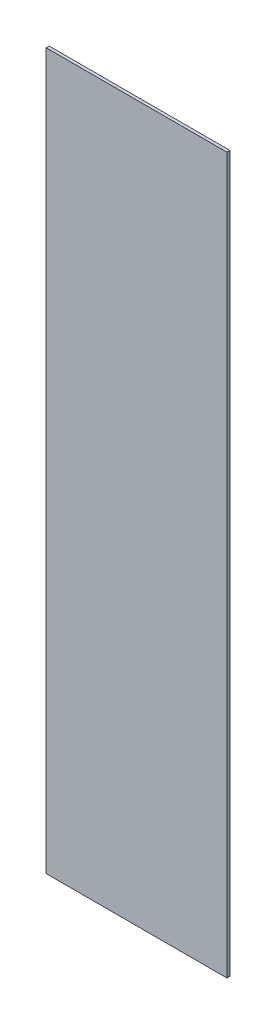
ISO-10303-21;
HEADER;
FILE_DESCRIPTION(('STEP AP214'),'2;1');
FILE_NAME('part.step','',(''),(''),'','','');
FILE_SCHEMA(('AUTOMOTIVE_DESIGN { 1 0 10303 214 1 1 1 1 }'));
ENDSEC;
DATA;
#1=APPLICATION_CONTEXT('core data for automotive mechanical design processes');
#2=APPLICATION_PROTOCOL_DEFINITION('international standard','automotive_design',2000,#1);
#3=PRODUCT_CONTEXT('',#1,'mechanical');
#4=PRODUCT('Part','Part','',(#3));
#5=PRODUCT_RELATED_PRODUCT_CATEGORY('part','',(#4));
#6=PRODUCT_DEFINITION_FORMATION('','',#4);
#7=PRODUCT_DEFINITION_CONTEXT('part definition',#1,'design');
#8=PRODUCT_DEFINITION('design','',#6,#7);
#9=PRODUCT_DEFINITION_SHAPE('','',#8);
#10=(LENGTH_UNIT() NAMED_UNIT(*) SI_UNIT(.MILLI.,.METRE.));
#11=(NAMED_UNIT(*) PLANE_ANGLE_UNIT() SI_UNIT($,.RADIAN.));
#12=(NAMED_UNIT(*) SI_UNIT($,.STERADIAN.) SOLID_ANGLE_UNIT());
#13=UNCERTAINTY_MEASURE_WITH_UNIT(LENGTH_MEASURE(1.E-05),#10,'distance_accuracy_value','');
#14=(GEOMETRIC_REPRESENTATION_CONTEXT(3) GLOBAL_UNCERTAINTY_ASSIGNED_CONTEXT((#13)) GLOBAL_UNIT_ASSIGNED_CONTEXT((#10,
#11,#12)) REPRESENTATION_CONTEXT('',''));
#15=CARTESIAN_POINT('',(0.,0.,0.));
#16=DIRECTION('',(0.,0.,1.));
#17=DIRECTION('',(1.,0.,0.));
#18=AXIS2_PLACEMENT_3D('',#15,#16,#17);
#19=CARTESIAN_POINT('',(0.04876188878365,0.295948113739439,0.00265058776767101));
#20=DIRECTION('',(-1.,0.,0.));
#21=DIRECTION('',(0.,0.,1.));
#22=AXIS2_PLACEMENT_3D('',#19,#20,#21);
#23=PLANE('',#22);
#24=DIRECTION('',(0.,0.,1.));
#25=VECTOR('',#24,1.);
#26=CARTESIAN_POINT('',(0.04876188878365,0.133896113739239,-4.94122323289E-05));
#27=LINE('',#26,#25);
#28=CARTESIAN_POINT('',(0.04876188878365,0.133896113739239,-4.94122323289E-05));
#29=VERTEX_POINT('',#28);
#30=CARTESIAN_POINT('',(0.04876188878365,0.133896113739239,0.00265058776767101));
#31=VERTEX_POINT('',#30);
#32=EDGE_CURVE('E11',#29,#31,#27,.T.);
#33=ORIENTED_EDGE('',*,*,#32,.T.);
#34=DIRECTION('',(0.,1.,0.));
#35=VECTOR('',#34,1.);
#36=CARTESIAN_POINT('',(0.04876188878365,0.133896113739239,0.00265058776767101));
#37=LINE('',#36,#35);
#38=CARTESIAN_POINT('',(0.04876188878365,0.458000113739639,0.00265058776767101));
#39=VERTEX_POINT('',#38);
#40=EDGE_CURVE('E24',#31,#39,#37,.T.);
#41=ORIENTED_EDGE('',*,*,#40,.T.);
#42=DIRECTION('',(0.,0.,1.));
#43=VECTOR('',#42,1.);
#44=CARTESIAN_POINT('',(0.04876188878365,0.458000113739639,-4.94122323289E-05));
#45=LINE('',#44,#43);
#46=CARTESIAN_POINT('',(0.04876188878365,0.458000113739639,-4.94122323289E-05));
#47=VERTEX_POINT('',#46);
#48=EDGE_CURVE('E99',#47,#39,#45,.T.);
#49=ORIENTED_EDGE('',*,*,#48,.F.);
#50=DIRECTION('',(0.,1.,0.));
#51=VECTOR('',#50,1.);
#52=CARTESIAN_POINT('',(0.04876188878365,0.133896113739239,-4.94122323289E-05));
#53=LINE('',#52,#51);
#54=EDGE_CURVE('E97',#29,#47,#53,.T.);
#55=ORIENTED_EDGE('',*,*,#54,.F.);
#56=EDGE_LOOP('',(#33,#41,#49,#55));
#57=FACE_BOUND('',#56,.T.);
#58=ADVANCED_FACE('F17',(#57),#23,.T.);
#59=CARTESIAN_POINT('',(0.13071918486355,0.458000113739639,0.00265058776767101));
#60=DIRECTION('',(0.,1.,0.));
#61=DIRECTION('',(0.,0.,1.));
#62=AXIS2_PLACEMENT_3D('',#59,#60,#61);
#63=PLANE('',#62);
#64=ORIENTED_EDGE('',*,*,#48,.T.);
#65=DIRECTION('',(1.,0.,0.));
#66=VECTOR('',#65,1.);
#67=CARTESIAN_POINT('',(0.04876188878365,0.458000113739639,0.00265058776767101));
#68=LINE('',#67,#66);
#69=CARTESIAN_POINT('',(0.21267648094345,0.458000113739639,0.00265058776767101));
#70=VERTEX_POINT('',#69);
#71=EDGE_CURVE('E95',#39,#70,#68,.T.);
#72=ORIENTED_EDGE('',*,*,#71,.T.);
#73=DIRECTION('',(0.,0.,1.));
#74=VECTOR('',#73,1.);
#75=CARTESIAN_POINT('',(0.21267648094345,0.458000113739639,-4.94122323289E-05));
#76=LINE('',#75,#74);
#77=CARTESIAN_POINT('',(0.21267648094345,0.458000113739639,-4.94122323289E-05));
#78=VERTEX_POINT('',#77);
#79=EDGE_CURVE('E92',#78,#70,#76,.T.);
#80=ORIENTED_EDGE('',*,*,#79,.F.);
#81=DIRECTION('',(1.,0.,0.));
#82=VECTOR('',#81,1.);
#83=CARTESIAN_POINT('',(0.04876188878365,0.458000113739639,-4.94122323289E-05));
#84=LINE('',#83,#82);
#85=EDGE_CURVE('E90',#47,#78,#84,.T.);
#86=ORIENTED_EDGE('',*,*,#85,.F.);
#87=EDGE_LOOP('',(#64,#72,#80,#86));
#88=FACE_BOUND('',#87,.T.);
#89=ADVANCED_FACE('F105',(#88),#63,.T.);
#90=CARTESIAN_POINT('',(0.21267648094345,0.133896113739689,0.00265058776767101));
#91=DIRECTION('',(1.,0.,0.));
#92=DIRECTION('',(0.,0.,-1.));
#93=AXIS2_PLACEMENT_3D('',#90,#91,#92);
#94=PLANE('',#93);
#95=ORIENTED_EDGE('',*,*,#79,.T.);
#96=DIRECTION('',(0.,-1.,0.));
#97=VECTOR('',#96,1.);
#98=CARTESIAN_POINT('',(0.21267648094345,0.458000113739639,0.00265058776767101));
#99=LINE('',#98,#97);
#100=CARTESIAN_POINT('',(0.21267648094345,-0.190207886260261,0.00265058776767101));
#101=VERTEX_POINT('',#100);
#102=EDGE_CURVE('E88',#70,#101,#99,.T.);
#103=ORIENTED_EDGE('',*,*,#102,.T.);
#104=DIRECTION('',(0.,0.,1.));
#105=VECTOR('',#104,1.);
#106=CARTESIAN_POINT('',(0.21267648094345,-0.190207886260261,-4.94122323289E-05));
#107=LINE('',#106,#105);
#108=CARTESIAN_POINT('',(0.21267648094345,-0.190207886260261,-4.94122323289E-05));
#109=VERTEX_POINT('',#108);
#110=EDGE_CURVE('E86',#109,#101,#107,.T.);
#111=ORIENTED_EDGE('',*,*,#110,.F.);
#112=DIRECTION('',(0.,-1.,0.));
#113=VECTOR('',#112,1.);
#114=CARTESIAN_POINT('',(0.21267648094345,0.458000113739639,-4.94122323289E-05));
#115=LINE('',#114,#113);
#116=EDGE_CURVE('E77',#78,#109,#115,.T.);
#117=ORIENTED_EDGE('',*,*,#116,.F.);
#118=EDGE_LOOP('',(#95,#103,#111,#117));
#119=FACE_BOUND('',#118,.T.);
#120=ADVANCED_FACE('F109',(#119),#94,.T.);
#121=CARTESIAN_POINT('',(0.13071918486355,-0.190207886260261,0.00265058776767101));
#122=DIRECTION('',(0.,-1.,0.));
#123=DIRECTION('',(0.,0.,-1.));
#124=AXIS2_PLACEMENT_3D('',#121,#122,#123);
#125=PLANE('',#124);
#126=ORIENTED_EDGE('',*,*,#110,.T.);
#127=DIRECTION('',(-1.,0.,0.));
#128=VECTOR('',#127,1.);
#129=CARTESIAN_POINT('',(0.21267648094345,-0.190207886260261,0.00265058776767101));
#130=LINE('',#129,#128);
#131=CARTESIAN_POINT('',(0.04876188878365,-0.190207886260261,0.00265058776767101));
#132=VERTEX_POINT('',#131);
#133=EDGE_CURVE('E66',#101,#132,#130,.T.);
#134=ORIENTED_EDGE('',*,*,#133,.T.);
#135=DIRECTION('',(0.,0.,1.));
#136=VECTOR('',#135,1.);
#137=CARTESIAN_POINT('',(0.04876188878365,-0.190207886260261,-4.94122323289E-05));
#138=LINE('',#137,#136);
#139=CARTESIAN_POINT('',(0.04876188878365,-0.190207886260261,-4.94122323289E-05));
#140=VERTEX_POINT('',#139);
#141=EDGE_CURVE('E60',#140,#132,#138,.T.);
#142=ORIENTED_EDGE('',*,*,#141,.F.);
#143=DIRECTION('',(-1.,0.,0.));
#144=VECTOR('',#143,1.);
#145=CARTESIAN_POINT('',(0.21267648094345,-0.190207886260261,-4.94122323289E-05));
#146=LINE('',#145,#144);
#147=EDGE_CURVE('E64',#109,#140,#146,.T.);
#148=ORIENTED_EDGE('',*,*,#147,.F.);
#149=EDGE_LOOP('',(#126,#134,#142,#148));
#150=FACE_BOUND('',#149,.T.);
#151=ADVANCED_FACE('F63',(#150),#125,.T.);
#152=CARTESIAN_POINT('',(0.04876188878365,-0.028155886260511,0.00265058776767101));
#153=DIRECTION('',(-1.,0.,0.));
#154=DIRECTION('',(0.,0.,1.));
#155=AXIS2_PLACEMENT_3D('',#152,#153,#154);
#156=PLANE('',#155);
#157=ORIENTED_EDGE('',*,*,#141,.T.);
#158=DIRECTION('',(0.,1.,0.));
#159=VECTOR('',#158,1.);
#160=CARTESIAN_POINT('',(0.04876188878365,-0.190207886260261,0.00265058776767101));
#161=LINE('',#160,#159);
#162=EDGE_CURVE('E78',#132,#31,#161,.T.);
#163=ORIENTED_EDGE('',*,*,#162,.T.);
#164=ORIENTED_EDGE('',*,*,#32,.F.);
#165=DIRECTION('',(0.,1.,0.));
#166=VECTOR('',#165,1.);
#167=CARTESIAN_POINT('',(0.04876188878365,-0.190207886260261,-4.94122323289E-05));
#168=LINE('',#167,#166);
#169=EDGE_CURVE('E74',#140,#29,#168,.T.);
#170=ORIENTED_EDGE('',*,*,#169,.F.);
#171=EDGE_LOOP('',(#157,#163,#164,#170));
#172=FACE_BOUND('',#171,.T.);
#173=ADVANCED_FACE('F80',(#172),#156,.T.);
#174=CARTESIAN_POINT('',(0.13071918486355,-0.190207886260261,-4.94122323289E-05));
#175=DIRECTION('',(0.,0.,1.));
#176=DIRECTION('',(1.,0.,0.));
#177=AXIS2_PLACEMENT_3D('',#174,#175,#176);
#178=PLANE('',#177);
#179=ORIENTED_EDGE('',*,*,#54,.T.);
#180=ORIENTED_EDGE('',*,*,#85,.T.);
#181=ORIENTED_EDGE('',*,*,#116,.T.);
#182=ORIENTED_EDGE('',*,*,#147,.T.);
#183=ORIENTED_EDGE('',*,*,#169,.T.);
#184=EDGE_LOOP('',(#179,#180,#181,#182,#183));
#185=FACE_BOUND('',#184,.T.);
#186=ADVANCED_FACE('F73',(#185),#178,.F.);
#187=CARTESIAN_POINT('',(0.13071918486355,-0.190207886260261,0.00265058776767101));
#188=DIRECTION('',(0.,0.,1.));
#189=DIRECTION('',(1.,0.,0.));
#190=AXIS2_PLACEMENT_3D('',#187,#188,#189);
#191=PLANE('',#190);
#192=ORIENTED_EDGE('',*,*,#40,.F.);
#193=ORIENTED_EDGE('',*,*,#162,.F.);
#194=ORIENTED_EDGE('',*,*,#133,.F.);
#195=ORIENTED_EDGE('',*,*,#102,.F.);
#196=ORIENTED_EDGE('',*,*,#71,.F.);
#197=EDGE_LOOP('',(#192,#193,#194,#195,#196));
#198=FACE_BOUND('',#197,.T.);
#199=ADVANCED_FACE('F107',(#198),#191,.T.);
#200=CLOSED_SHELL('',(#58,#89,#120,#151,#173,#186,#199));
#201=MANIFOLD_SOLID_BREP('B1',#200);
#202=ADVANCED_BREP_SHAPE_REPRESENTATION('',(#18,#201),#14);
#203=SHAPE_DEFINITION_REPRESENTATION(#9,#202);
ENDSEC;
END-ISO-10303-21;
